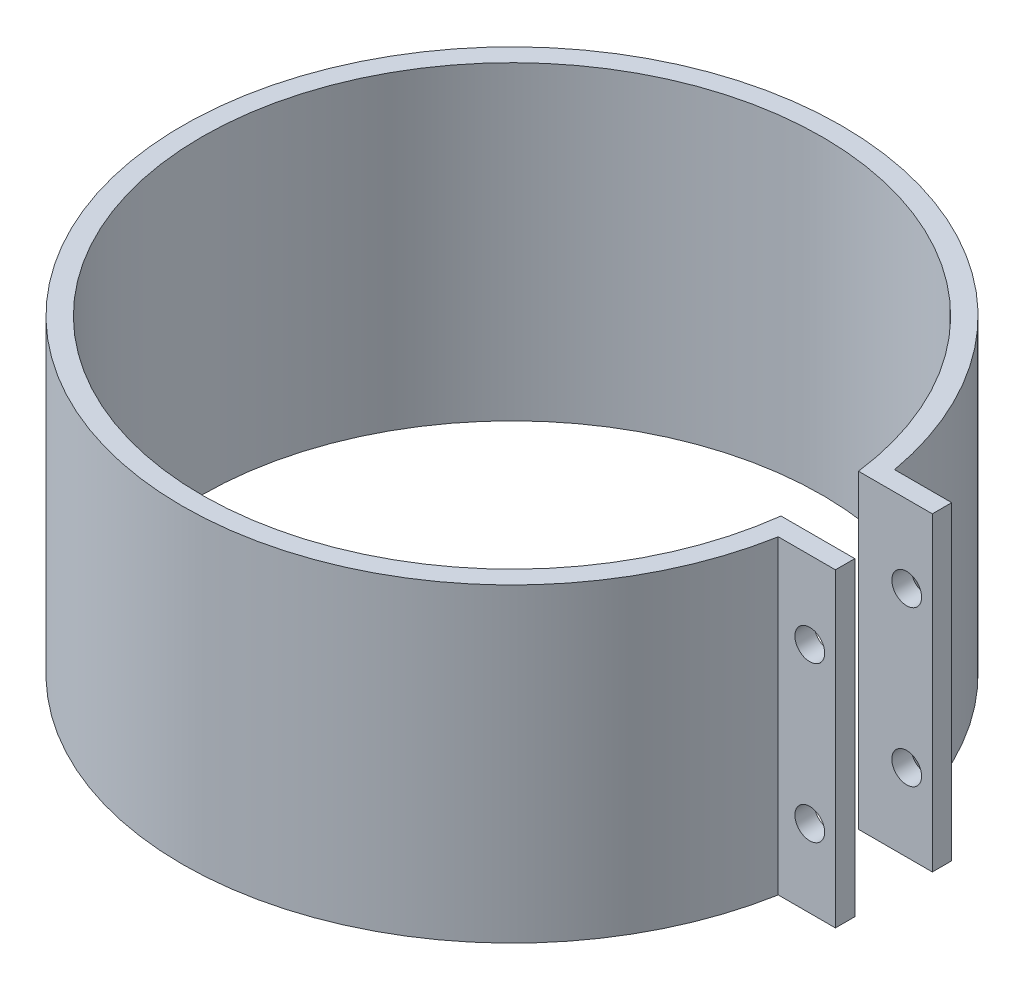
ISO-10303-21;
HEADER;
FILE_DESCRIPTION(('STEP AP214'),'2;1');
FILE_NAME('part.step','',(''),(''),'','','');
FILE_SCHEMA(('AUTOMOTIVE_DESIGN { 1 0 10303 214 1 1 1 1 }'));
ENDSEC;
DATA;
#1=APPLICATION_CONTEXT('core data for automotive mechanical design processes');
#2=APPLICATION_PROTOCOL_DEFINITION('international standard','automotive_design',2000,#1);
#3=PRODUCT_CONTEXT('',#1,'mechanical');
#4=PRODUCT('Part','Part','',(#3));
#5=PRODUCT_RELATED_PRODUCT_CATEGORY('part','',(#4));
#6=PRODUCT_DEFINITION_FORMATION('','',#4);
#7=PRODUCT_DEFINITION_CONTEXT('part definition',#1,'design');
#8=PRODUCT_DEFINITION('design','',#6,#7);
#9=PRODUCT_DEFINITION_SHAPE('','',#8);
#10=(LENGTH_UNIT() NAMED_UNIT(*) SI_UNIT(.MILLI.,.METRE.));
#11=(NAMED_UNIT(*) PLANE_ANGLE_UNIT() SI_UNIT($,.RADIAN.));
#12=(NAMED_UNIT(*) SI_UNIT($,.STERADIAN.) SOLID_ANGLE_UNIT());
#13=UNCERTAINTY_MEASURE_WITH_UNIT(LENGTH_MEASURE(1.E-05),#10,'distance_accuracy_value','');
#14=(GEOMETRIC_REPRESENTATION_CONTEXT(3) GLOBAL_UNCERTAINTY_ASSIGNED_CONTEXT((#13)) GLOBAL_UNIT_ASSIGNED_CONTEXT((#10,
#11,#12)) REPRESENTATION_CONTEXT('',''));
#15=CARTESIAN_POINT('',(0.,0.,0.));
#16=DIRECTION('',(0.,0.,1.));
#17=DIRECTION('',(1.,0.,0.));
#18=AXIS2_PLACEMENT_3D('',#15,#16,#17);
#19=CARTESIAN_POINT('',(0.,50.8,0.));
#20=DIRECTION('',(0.,-1.,0.));
#21=DIRECTION('',(0.,0.,-1.));
#22=AXIS2_PLACEMENT_3D('',#19,#20,#21);
#23=CYLINDRICAL_SURFACE('',#22,53.975);
#24=CARTESIAN_POINT('',(0.,0.,0.));
#25=DIRECTION('',(0.,1.,0.));
#26=DIRECTION('',(0.,0.,1.));
#27=AXIS2_PLACEMENT_3D('',#24,#25,#26);
#28=CIRCLE('',#27,53.975);
#29=CARTESIAN_POINT('',(53.1279116849138,0.,-9.525));
#30=VERTEX_POINT('',#29);
#31=CARTESIAN_POINT('',(53.1279116849138,0.,9.525));
#32=VERTEX_POINT('',#31);
#33=EDGE_CURVE('E135',#30,#32,#28,.T.);
#34=ORIENTED_EDGE('',*,*,#33,.T.);
#35=DIRECTION('',(0.,-1.,0.));
#36=VECTOR('',#35,1.);
#37=CARTESIAN_POINT('',(53.1279116849138,50.8,9.525));
#38=LINE('',#37,#36);
#39=CARTESIAN_POINT('',(53.1279116849138,50.8,9.525));
#40=VERTEX_POINT('',#39);
#41=EDGE_CURVE('E11',#40,#32,#38,.T.);
#42=ORIENTED_EDGE('',*,*,#41,.F.);
#43=CARTESIAN_POINT('',(0.,50.8,0.));
#44=DIRECTION('',(0.,1.,0.));
#45=DIRECTION('',(0.,0.,1.));
#46=AXIS2_PLACEMENT_3D('',#43,#44,#45);
#47=CIRCLE('',#46,53.975);
#48=CARTESIAN_POINT('',(53.1279116849138,50.8,-9.525));
#49=VERTEX_POINT('',#48);
#50=EDGE_CURVE('E155',#49,#40,#47,.T.);
#51=ORIENTED_EDGE('',*,*,#50,.F.);
#52=DIRECTION('',(0.,-1.,0.));
#53=VECTOR('',#52,1.);
#54=CARTESIAN_POINT('',(53.1279116849138,50.8,-9.525));
#55=LINE('',#54,#53);
#56=EDGE_CURVE('E131',#49,#30,#55,.T.);
#57=ORIENTED_EDGE('',*,*,#56,.T.);
#58=EDGE_LOOP('',(#34,#42,#51,#57));
#59=FACE_BOUND('',#58,.T.);
#60=ADVANCED_FACE('F37',(#59),#23,.T.);
#61=CARTESIAN_POINT('',(53.6001690762259,50.8,9.525));
#62=DIRECTION('',(0.,0.,-1.));
#63=DIRECTION('',(-1.,0.,0.));
#64=AXIS2_PLACEMENT_3D('',#61,#62,#63);
#65=PLANE('',#64);
#66=CARTESIAN_POINT('',(58.2922060609041,38.1,9.525));
#67=DIRECTION('',(0.,0.,1.));
#68=DIRECTION('',(1.,0.,0.));
#69=AXIS2_PLACEMENT_3D('',#66,#67,#68);
#70=CIRCLE('',#69,2.4384);
#71=CARTESIAN_POINT('',(60.7306060609041,38.1,9.52499999999998));
#72=VERTEX_POINT('',#71);
#73=EDGE_CURVE('E169',#72,#72,#70,.T.);
#74=ORIENTED_EDGE('',*,*,#73,.F.);
#75=EDGE_LOOP('',(#74));
#76=FACE_BOUND('',#75,.T.);
#77=CARTESIAN_POINT('',(58.2922060609041,12.7,9.525));
#78=DIRECTION('',(0.,0.,1.));
#79=DIRECTION('',(1.,0.,0.));
#80=AXIS2_PLACEMENT_3D('',#77,#78,#79);
#81=CIRCLE('',#80,2.4384);
#82=CARTESIAN_POINT('',(60.7306060609041,12.7,9.52499999999998));
#83=VERTEX_POINT('',#82);
#84=EDGE_CURVE('E176',#83,#83,#81,.T.);
#85=ORIENTED_EDGE('',*,*,#84,.F.);
#86=EDGE_LOOP('',(#85));
#87=FACE_BOUND('',#86,.T.);
#88=DIRECTION('',(1.,0.,0.));
#89=VECTOR('',#88,1.);
#90=CARTESIAN_POINT('',(53.6001690762259,0.,9.525));
#91=LINE('',#90,#89);
#92=CARTESIAN_POINT('',(62.4901690762259,0.,9.525));
#93=VERTEX_POINT('',#92);
#94=EDGE_CURVE('E139',#32,#93,#91,.T.);
#95=ORIENTED_EDGE('',*,*,#94,.T.);
#96=DIRECTION('',(0.,-1.,0.));
#97=VECTOR('',#96,1.);
#98=CARTESIAN_POINT('',(62.4901690762259,50.8,9.525));
#99=LINE('',#98,#97);
#100=CARTESIAN_POINT('',(62.4901690762259,50.8,9.525));
#101=VERTEX_POINT('',#100);
#102=EDGE_CURVE('E46',#101,#93,#99,.T.);
#103=ORIENTED_EDGE('',*,*,#102,.F.);
#104=DIRECTION('',(1.,0.,0.));
#105=VECTOR('',#104,1.);
#106=CARTESIAN_POINT('',(53.6001690762259,50.8,9.525));
#107=LINE('',#106,#105);
#108=EDGE_CURVE('E96',#40,#101,#107,.T.);
#109=ORIENTED_EDGE('',*,*,#108,.F.);
#110=ORIENTED_EDGE('',*,*,#41,.T.);
#111=EDGE_LOOP('',(#95,#103,#109,#110));
#112=FACE_BOUND('',#111,.T.);
#113=ADVANCED_FACE('F210',(#76,#87,#112),#65,.F.);
#114=CARTESIAN_POINT('',(62.4901690762259,50.8,6.35));
#115=DIRECTION('',(-1.,0.,0.));
#116=DIRECTION('',(0.,0.,1.));
#117=AXIS2_PLACEMENT_3D('',#114,#115,#116);
#118=PLANE('',#117);
#119=DIRECTION('',(0.,0.,-1.));
#120=VECTOR('',#119,1.);
#121=CARTESIAN_POINT('',(62.4901690762259,0.,6.35));
#122=LINE('',#121,#120);
#123=CARTESIAN_POINT('',(62.4901690762259,0.,6.35));
#124=VERTEX_POINT('',#123);
#125=EDGE_CURVE('E142',#93,#124,#122,.T.);
#126=ORIENTED_EDGE('',*,*,#125,.T.);
#127=DIRECTION('',(0.,-1.,0.));
#128=VECTOR('',#127,1.);
#129=CARTESIAN_POINT('',(62.4901690762259,50.8,6.35));
#130=LINE('',#129,#128);
#131=CARTESIAN_POINT('',(62.4901690762259,50.8,6.35));
#132=VERTEX_POINT('',#131);
#133=EDGE_CURVE('E162',#132,#124,#130,.T.);
#134=ORIENTED_EDGE('',*,*,#133,.F.);
#135=DIRECTION('',(0.,0.,-1.));
#136=VECTOR('',#135,1.);
#137=CARTESIAN_POINT('',(62.4901690762259,50.8,6.35));
#138=LINE('',#137,#136);
#139=EDGE_CURVE('E192',#101,#132,#138,.T.);
#140=ORIENTED_EDGE('',*,*,#139,.F.);
#141=ORIENTED_EDGE('',*,*,#102,.T.);
#142=EDGE_LOOP('',(#126,#134,#140,#141));
#143=FACE_BOUND('',#142,.T.);
#144=ADVANCED_FACE('F212',(#143),#118,.F.);
#145=CARTESIAN_POINT('',(53.6001690762259,50.8,6.35));
#146=DIRECTION('',(0.,0.,1.));
#147=DIRECTION('',(1.,0.,0.));
#148=AXIS2_PLACEMENT_3D('',#145,#146,#147);
#149=PLANE('',#148);
#150=CARTESIAN_POINT('',(58.2922060609041,38.1,6.35));
#151=DIRECTION('',(0.,0.,1.));
#152=DIRECTION('',(1.,0.,0.));
#153=AXIS2_PLACEMENT_3D('',#150,#151,#152);
#154=CIRCLE('',#153,2.4384);
#155=CARTESIAN_POINT('',(60.7306060609041,38.1,6.34999999999999));
#156=VERTEX_POINT('',#155);
#157=EDGE_CURVE('E140',#156,#156,#154,.T.);
#158=ORIENTED_EDGE('',*,*,#157,.T.);
#159=EDGE_LOOP('',(#158));
#160=FACE_BOUND('',#159,.T.);
#161=CARTESIAN_POINT('',(58.2922060609041,12.7,6.35));
#162=DIRECTION('',(0.,0.,1.));
#163=DIRECTION('',(1.,0.,0.));
#164=AXIS2_PLACEMENT_3D('',#161,#162,#163);
#165=CIRCLE('',#164,2.4384);
#166=CARTESIAN_POINT('',(60.7306060609041,12.7,6.34999999999999));
#167=VERTEX_POINT('',#166);
#168=EDGE_CURVE('E173',#167,#167,#165,.T.);
#169=ORIENTED_EDGE('',*,*,#168,.T.);
#170=EDGE_LOOP('',(#169));
#171=FACE_BOUND('',#170,.T.);
#172=DIRECTION('',(-1.,0.,0.));
#173=VECTOR('',#172,1.);
#174=CARTESIAN_POINT('',(53.6001690762259,0.,6.35));
#175=LINE('',#174,#173);
#176=CARTESIAN_POINT('',(50.4015624757805,0.,6.35000000000001));
#177=VERTEX_POINT('',#176);
#178=EDGE_CURVE('E145',#124,#177,#175,.T.);
#179=ORIENTED_EDGE('',*,*,#178,.T.);
#180=DIRECTION('',(0.,-1.,0.));
#181=VECTOR('',#180,1.);
#182=CARTESIAN_POINT('',(50.4015624757805,50.8,6.35000000000001));
#183=LINE('',#182,#181);
#184=CARTESIAN_POINT('',(50.4015624757805,50.8,6.35000000000001));
#185=VERTEX_POINT('',#184);
#186=EDGE_CURVE('E159',#185,#177,#183,.T.);
#187=ORIENTED_EDGE('',*,*,#186,.F.);
#188=DIRECTION('',(-1.,0.,0.));
#189=VECTOR('',#188,1.);
#190=CARTESIAN_POINT('',(53.6001690762259,50.8,6.35));
#191=LINE('',#190,#189);
#192=EDGE_CURVE('E194',#132,#185,#191,.T.);
#193=ORIENTED_EDGE('',*,*,#192,.F.);
#194=ORIENTED_EDGE('',*,*,#133,.T.);
#195=EDGE_LOOP('',(#179,#187,#193,#194));
#196=FACE_BOUND('',#195,.T.);
#197=ADVANCED_FACE('F200',(#160,#171,#196),#149,.F.);
#198=CARTESIAN_POINT('',(0.,50.8,0.));
#199=DIRECTION('',(0.,-1.,0.));
#200=DIRECTION('',(0.,0.,-1.));
#201=AXIS2_PLACEMENT_3D('',#198,#199,#200);
#202=CYLINDRICAL_SURFACE('',#201,50.8);
#203=CARTESIAN_POINT('',(0.,0.,0.));
#204=DIRECTION('',(0.,-1.,0.));
#205=DIRECTION('',(0.,0.,1.));
#206=AXIS2_PLACEMENT_3D('',#203,#204,#205);
#207=CIRCLE('',#206,50.8);
#208=CARTESIAN_POINT('',(50.4015624757805,0.,-6.35));
#209=VERTEX_POINT('',#208);
#210=EDGE_CURVE('E147',#177,#209,#207,.T.);
#211=ORIENTED_EDGE('',*,*,#210,.T.);
#212=DIRECTION('',(0.,-1.,0.));
#213=VECTOR('',#212,1.);
#214=CARTESIAN_POINT('',(50.4015624757805,50.8,-6.35));
#215=LINE('',#214,#213);
#216=CARTESIAN_POINT('',(50.4015624757805,50.8,-6.35));
#217=VERTEX_POINT('',#216);
#218=EDGE_CURVE('E126',#217,#209,#215,.T.);
#219=ORIENTED_EDGE('',*,*,#218,.F.);
#220=CARTESIAN_POINT('',(0.,50.8,0.));
#221=DIRECTION('',(0.,-1.,0.));
#222=DIRECTION('',(0.,0.,1.));
#223=AXIS2_PLACEMENT_3D('',#220,#221,#222);
#224=CIRCLE('',#223,50.8);
#225=EDGE_CURVE('E116',#185,#217,#224,.T.);
#226=ORIENTED_EDGE('',*,*,#225,.F.);
#227=ORIENTED_EDGE('',*,*,#186,.T.);
#228=EDGE_LOOP('',(#211,#219,#226,#227));
#229=FACE_BOUND('',#228,.T.);
#230=ADVANCED_FACE('F203',(#229),#202,.F.);
#231=CARTESIAN_POINT('',(53.6001690762259,50.8,-6.35));
#232=DIRECTION('',(0.,0.,-1.));
#233=DIRECTION('',(-1.,0.,0.));
#234=AXIS2_PLACEMENT_3D('',#231,#232,#233);
#235=PLANE('',#234);
#236=CARTESIAN_POINT('',(58.2922060609041,38.1,-6.35));
#237=DIRECTION('',(0.,0.,-1.));
#238=DIRECTION('',(-1.,0.,0.));
#239=AXIS2_PLACEMENT_3D('',#236,#237,#238);
#240=CIRCLE('',#239,2.4384);
#241=CARTESIAN_POINT('',(60.7306060609041,38.1,-6.34999999999999));
#242=VERTEX_POINT('',#241);
#243=EDGE_CURVE('E185',#242,#242,#240,.T.);
#244=ORIENTED_EDGE('',*,*,#243,.T.);
#245=EDGE_LOOP('',(#244));
#246=FACE_BOUND('',#245,.T.);
#247=CARTESIAN_POINT('',(58.2922060609041,12.7,-6.35));
#248=DIRECTION('',(0.,0.,-1.));
#249=DIRECTION('',(-1.,0.,0.));
#250=AXIS2_PLACEMENT_3D('',#247,#248,#249);
#251=CIRCLE('',#250,2.4384);
#252=CARTESIAN_POINT('',(60.7306060609041,12.7,-6.34999999999999));
#253=VERTEX_POINT('',#252);
#254=EDGE_CURVE('E168',#253,#253,#251,.T.);
#255=ORIENTED_EDGE('',*,*,#254,.T.);
#256=EDGE_LOOP('',(#255));
#257=FACE_BOUND('',#256,.T.);
#258=DIRECTION('',(1.,0.,0.));
#259=VECTOR('',#258,1.);
#260=CARTESIAN_POINT('',(53.6001690762259,0.,-6.35));
#261=LINE('',#260,#259);
#262=CARTESIAN_POINT('',(62.4901690762259,0.,-6.35));
#263=VERTEX_POINT('',#262);
#264=EDGE_CURVE('E124',#209,#263,#261,.T.);
#265=ORIENTED_EDGE('',*,*,#264,.T.);
#266=DIRECTION('',(0.,-1.,0.));
#267=VECTOR('',#266,1.);
#268=CARTESIAN_POINT('',(62.4901690762259,50.8,-6.35));
#269=LINE('',#268,#267);
#270=CARTESIAN_POINT('',(62.4901690762259,50.8,-6.35));
#271=VERTEX_POINT('',#270);
#272=EDGE_CURVE('E122',#271,#263,#269,.T.);
#273=ORIENTED_EDGE('',*,*,#272,.F.);
#274=DIRECTION('',(1.,0.,0.));
#275=VECTOR('',#274,1.);
#276=CARTESIAN_POINT('',(53.6001690762259,50.8,-6.35));
#277=LINE('',#276,#275);
#278=EDGE_CURVE('E109',#217,#271,#277,.T.);
#279=ORIENTED_EDGE('',*,*,#278,.F.);
#280=ORIENTED_EDGE('',*,*,#218,.T.);
#281=EDGE_LOOP('',(#265,#273,#279,#280));
#282=FACE_BOUND('',#281,.T.);
#283=ADVANCED_FACE('F123',(#246,#257,#282),#235,.F.);
#284=CARTESIAN_POINT('',(62.4901690762259,50.8,-9.525));
#285=DIRECTION('',(-1.,0.,0.));
#286=DIRECTION('',(0.,0.,1.));
#287=AXIS2_PLACEMENT_3D('',#284,#285,#286);
#288=PLANE('',#287);
#289=DIRECTION('',(0.,0.,-1.));
#290=VECTOR('',#289,1.);
#291=CARTESIAN_POINT('',(62.4901690762259,0.,-9.525));
#292=LINE('',#291,#290);
#293=CARTESIAN_POINT('',(62.4901690762259,0.,-9.525));
#294=VERTEX_POINT('',#293);
#295=EDGE_CURVE('E152',#263,#294,#292,.T.);
#296=ORIENTED_EDGE('',*,*,#295,.T.);
#297=DIRECTION('',(0.,-1.,0.));
#298=VECTOR('',#297,1.);
#299=CARTESIAN_POINT('',(62.4901690762259,50.8,-9.525));
#300=LINE('',#299,#298);
#301=CARTESIAN_POINT('',(62.4901690762259,50.8,-9.525));
#302=VERTEX_POINT('',#301);
#303=EDGE_CURVE('E127',#302,#294,#300,.T.);
#304=ORIENTED_EDGE('',*,*,#303,.F.);
#305=DIRECTION('',(0.,0.,-1.));
#306=VECTOR('',#305,1.);
#307=CARTESIAN_POINT('',(62.4901690762259,50.8,-9.525));
#308=LINE('',#307,#306);
#309=EDGE_CURVE('E113',#271,#302,#308,.T.);
#310=ORIENTED_EDGE('',*,*,#309,.F.);
#311=ORIENTED_EDGE('',*,*,#272,.T.);
#312=EDGE_LOOP('',(#296,#304,#310,#311));
#313=FACE_BOUND('',#312,.T.);
#314=ADVANCED_FACE('F129',(#313),#288,.F.);
#315=CARTESIAN_POINT('',(53.6001690762259,50.8,-9.525));
#316=DIRECTION('',(0.,0.,1.));
#317=DIRECTION('',(1.,0.,0.));
#318=AXIS2_PLACEMENT_3D('',#315,#316,#317);
#319=PLANE('',#318);
#320=CARTESIAN_POINT('',(58.2922060609041,38.1,-9.52500000000003));
#321=DIRECTION('',(0.,0.,1.));
#322=DIRECTION('',(1.,0.,0.));
#323=AXIS2_PLACEMENT_3D('',#320,#321,#322);
#324=CIRCLE('',#323,2.4384);
#325=CARTESIAN_POINT('',(60.7306060609041,38.1,-9.52500000000005));
#326=VERTEX_POINT('',#325);
#327=EDGE_CURVE('E40',#326,#326,#324,.T.);
#328=ORIENTED_EDGE('',*,*,#327,.T.);
#329=EDGE_LOOP('',(#328));
#330=FACE_BOUND('',#329,.T.);
#331=CARTESIAN_POINT('',(58.2922060609041,12.7,-9.52500000000003));
#332=DIRECTION('',(0.,0.,1.));
#333=DIRECTION('',(1.,0.,0.));
#334=AXIS2_PLACEMENT_3D('',#331,#332,#333);
#335=CIRCLE('',#334,2.4384);
#336=CARTESIAN_POINT('',(60.7306060609041,12.7,-9.52500000000005));
#337=VERTEX_POINT('',#336);
#338=EDGE_CURVE('E166',#337,#337,#335,.T.);
#339=ORIENTED_EDGE('',*,*,#338,.T.);
#340=EDGE_LOOP('',(#339));
#341=FACE_BOUND('',#340,.T.);
#342=DIRECTION('',(-1.,0.,0.));
#343=VECTOR('',#342,1.);
#344=CARTESIAN_POINT('',(53.6001690762259,0.,-9.525));
#345=LINE('',#344,#343);
#346=EDGE_CURVE('E84',#294,#30,#345,.T.);
#347=ORIENTED_EDGE('',*,*,#346,.T.);
#348=ORIENTED_EDGE('',*,*,#56,.F.);
#349=DIRECTION('',(-1.,0.,0.));
#350=VECTOR('',#349,1.);
#351=CARTESIAN_POINT('',(53.6001690762259,50.8,-9.525));
#352=LINE('',#351,#350);
#353=EDGE_CURVE('E55',#302,#49,#352,.T.);
#354=ORIENTED_EDGE('',*,*,#353,.F.);
#355=ORIENTED_EDGE('',*,*,#303,.T.);
#356=EDGE_LOOP('',(#347,#348,#354,#355));
#357=FACE_BOUND('',#356,.T.);
#358=ADVANCED_FACE('F206',(#330,#341,#357),#319,.F.);
#359=CARTESIAN_POINT('',(0.,50.8,0.));
#360=DIRECTION('',(0.,1.,0.));
#361=DIRECTION('',(0.,0.,1.));
#362=AXIS2_PLACEMENT_3D('',#359,#360,#361);
#363=PLANE('',#362);
#364=ORIENTED_EDGE('',*,*,#50,.T.);
#365=ORIENTED_EDGE('',*,*,#108,.T.);
#366=ORIENTED_EDGE('',*,*,#139,.T.);
#367=ORIENTED_EDGE('',*,*,#192,.T.);
#368=ORIENTED_EDGE('',*,*,#225,.T.);
#369=ORIENTED_EDGE('',*,*,#278,.T.);
#370=ORIENTED_EDGE('',*,*,#309,.T.);
#371=ORIENTED_EDGE('',*,*,#353,.T.);
#372=EDGE_LOOP('',(#364,#365,#366,#367,#368,#369,#370,#371));
#373=FACE_BOUND('',#372,.T.);
#374=ADVANCED_FACE('F111',(#373),#363,.T.);
#375=CARTESIAN_POINT('',(0.,0.,0.));
#376=DIRECTION('',(0.,1.,0.));
#377=DIRECTION('',(0.,0.,1.));
#378=AXIS2_PLACEMENT_3D('',#375,#376,#377);
#379=PLANE('',#378);
#380=ORIENTED_EDGE('',*,*,#33,.F.);
#381=ORIENTED_EDGE('',*,*,#346,.F.);
#382=ORIENTED_EDGE('',*,*,#295,.F.);
#383=ORIENTED_EDGE('',*,*,#264,.F.);
#384=ORIENTED_EDGE('',*,*,#210,.F.);
#385=ORIENTED_EDGE('',*,*,#178,.F.);
#386=ORIENTED_EDGE('',*,*,#125,.F.);
#387=ORIENTED_EDGE('',*,*,#94,.F.);
#388=EDGE_LOOP('',(#380,#381,#382,#383,#384,#385,#386,#387));
#389=FACE_BOUND('',#388,.T.);
#390=ADVANCED_FACE('F204',(#389),#379,.F.);
#391=CARTESIAN_POINT('',(58.2922060609041,12.7,-53.975));
#392=DIRECTION('',(0.,0.,1.));
#393=DIRECTION('',(1.,0.,0.));
#394=AXIS2_PLACEMENT_3D('',#391,#392,#393);
#395=CYLINDRICAL_SURFACE('',#394,2.4384);
#396=CARTESIAN_POINT('',(60.7306060609041,12.7,-9.52500000000005));
#397=CARTESIAN_POINT('',(60.7306060609041,12.7,-9.49192708333338));
#398=CARTESIAN_POINT('',(60.7306060609041,12.7,-9.45885416666671));
#399=CARTESIAN_POINT('',(60.7306060609041,12.7,-9.39270833333338));
#400=CARTESIAN_POINT('',(60.7306060609041,12.7,-9.35963541666671));
#401=CARTESIAN_POINT('',(60.7306060609041,12.7,-9.29348958333338));
#402=CARTESIAN_POINT('',(60.7306060609041,12.7,-9.26041666666671));
#403=CARTESIAN_POINT('',(60.7306060609041,12.7,-9.19427083333337));
#404=CARTESIAN_POINT('',(60.7306060609041,12.7,-9.16119791666671));
#405=CARTESIAN_POINT('',(60.7306060609041,12.7,-9.09505208333337));
#406=CARTESIAN_POINT('',(60.7306060609041,12.7,-9.06197916666671));
#407=CARTESIAN_POINT('',(60.7306060609041,12.7,-8.99583333333337));
#408=CARTESIAN_POINT('',(60.7306060609041,12.7,-8.96276041666671));
#409=CARTESIAN_POINT('',(60.7306060609041,12.7,-8.89661458333337));
#410=CARTESIAN_POINT('',(60.7306060609041,12.7,-8.8635416666667));
#411=CARTESIAN_POINT('',(60.7306060609041,12.7,-8.79739583333337));
#412=CARTESIAN_POINT('',(60.7306060609041,12.7,-8.7643229166667));
#413=CARTESIAN_POINT('',(60.7306060609041,12.7,-8.69817708333337));
#414=CARTESIAN_POINT('',(60.7306060609041,12.7,-8.6651041666667));
#415=CARTESIAN_POINT('',(60.7306060609041,12.7,-8.59895833333336));
#416=CARTESIAN_POINT('',(60.7306060609041,12.7,-8.5658854166667));
#417=CARTESIAN_POINT('',(60.7306060609041,12.7,-8.49973958333336));
#418=CARTESIAN_POINT('',(60.7306060609041,12.7,-8.4666666666667));
#419=CARTESIAN_POINT('',(60.7306060609041,12.7,-8.40052083333336));
#420=CARTESIAN_POINT('',(60.7306060609041,12.7,-8.36744791666669));
#421=CARTESIAN_POINT('',(60.7306060609041,12.7,-8.30130208333336));
#422=CARTESIAN_POINT('',(60.7306060609041,12.7,-8.26822916666669));
#423=CARTESIAN_POINT('',(60.7306060609041,12.7,-8.20208333333336));
#424=CARTESIAN_POINT('',(60.7306060609041,12.7,-8.16901041666669));
#425=CARTESIAN_POINT('',(60.7306060609041,12.7,-8.10286458333336));
#426=CARTESIAN_POINT('',(60.7306060609041,12.7,-8.06979166666669));
#427=CARTESIAN_POINT('',(60.7306060609041,12.7,-8.00364583333336));
#428=CARTESIAN_POINT('',(60.7306060609041,12.7,-7.97057291666669));
#429=CARTESIAN_POINT('',(60.7306060609041,12.7,-7.90442708333335));
#430=CARTESIAN_POINT('',(60.7306060609041,12.7,-7.87135416666668));
#431=CARTESIAN_POINT('',(60.7306060609041,12.7,-7.80520833333335));
#432=CARTESIAN_POINT('',(60.7306060609041,12.7,-7.77213541666668));
#433=CARTESIAN_POINT('',(60.7306060609041,12.7,-7.70598958333335));
#434=CARTESIAN_POINT('',(60.7306060609041,12.7,-7.67291666666668));
#435=CARTESIAN_POINT('',(60.7306060609041,12.7,-7.60677083333335));
#436=CARTESIAN_POINT('',(60.7306060609041,12.7,-7.57369791666668));
#437=CARTESIAN_POINT('',(60.7306060609041,12.7,-7.50755208333335));
#438=CARTESIAN_POINT('',(60.7306060609041,12.7,-7.47447916666668));
#439=CARTESIAN_POINT('',(60.7306060609041,12.7,-7.40833333333335));
#440=CARTESIAN_POINT('',(60.7306060609041,12.7,-7.37526041666668));
#441=CARTESIAN_POINT('',(60.7306060609041,12.7,-7.30911458333335));
#442=CARTESIAN_POINT('',(60.7306060609041,12.7,-7.27604166666668));
#443=CARTESIAN_POINT('',(60.7306060609041,12.7,-7.20989583333334));
#444=CARTESIAN_POINT('',(60.7306060609041,12.7,-7.17682291666667));
#445=CARTESIAN_POINT('',(60.7306060609041,12.7,-7.11067708333334));
#446=CARTESIAN_POINT('',(60.7306060609041,12.7,-7.07760416666667));
#447=CARTESIAN_POINT('',(60.7306060609041,12.7,-7.01145833333334));
#448=CARTESIAN_POINT('',(60.7306060609041,12.7,-6.97838541666667));
#449=CARTESIAN_POINT('',(60.7306060609041,12.7,-6.91223958333334));
#450=CARTESIAN_POINT('',(60.7306060609041,12.7,-6.87916666666667));
#451=CARTESIAN_POINT('',(60.7306060609041,12.7,-6.81302083333334));
#452=CARTESIAN_POINT('',(60.7306060609041,12.7,-6.77994791666667));
#453=CARTESIAN_POINT('',(60.7306060609041,12.7,-6.71380208333333));
#454=CARTESIAN_POINT('',(60.7306060609041,12.7,-6.68072916666667));
#455=CARTESIAN_POINT('',(60.7306060609041,12.7,-6.61458333333333));
#456=CARTESIAN_POINT('',(60.7306060609041,12.7,-6.58151041666667));
#457=CARTESIAN_POINT('',(60.7306060609041,12.7,-6.51536458333333));
#458=CARTESIAN_POINT('',(60.7306060609041,12.7,-6.48229166666667));
#459=CARTESIAN_POINT('',(60.7306060609041,12.7,-6.41614583333333));
#460=CARTESIAN_POINT('',(60.7306060609041,12.7,-6.38307291666666));
#461=CARTESIAN_POINT('',(60.7306060609041,12.7,-6.34999999999999));
#462=B_SPLINE_CURVE_WITH_KNOTS('',3,(#396,#397,#398,#399,#400,#401,#402,#403,#404,#405,#406,
#407,#408,#409,#410,#411,#412,#413,#414,#415,#416,#417,#418,#419,#420,#421,#422,#423,#424,#425,
#426,#427,#428,#429,#430,#431,#432,#433,#434,#435,#436,#437,#438,#439,#440,#441,#442,#443,#444,
#445,#446,#447,#448,#449,#450,#451,#452,#453,#454,#455,#456,#457,#458,#459,#460,#461),
.UNSPECIFIED.,.F.,.F.,(4,2,2,2,2,2,2,2,2,2,2,2,2,2,2,2,2,2,2,2,2,2,2,2,2,2,2,2,2,2,2,2,4),(0.,
0.0992187500000047,0.198437500000002,0.297656250000007,0.396875000000005,0.49609375000001,
0.595312500000007,0.694531250000012,0.79375000000001,0.892968750000014,0.992187500000019,
1.09140625000002,1.19062500000002,1.28984375000002,1.38906250000002,1.48828125000002,
1.58750000000003,1.68671875000003,1.78593750000003,1.88515625000003,1.98437500000003,
2.08359375000004,2.18281250000003,2.28203125000004,2.38125000000004,2.48046875000004,
2.57968750000005,2.67890625000004,2.77812500000005,2.87734375000005,2.97656250000005,
3.07578125000005,3.17500000000005),.UNSPECIFIED.);
#463=EDGE_CURVE('BSEAM274',#337,#253,#462,.T.);
#464=ORIENTED_EDGE('',*,*,#338,.F.);
#465=ORIENTED_EDGE('',*,*,#254,.F.);
#466=ORIENTED_EDGE('',*,*,#463,.T.);
#467=ORIENTED_EDGE('',*,*,#463,.F.);
#468=EDGE_LOOP('',(#464,#466,#465,#467));
#469=FACE_BOUND('',#468,.T.);
#470=ADVANCED_FACE('F274',(#469),#395,.F.);
#471=CARTESIAN_POINT('',(58.2922060609041,38.1,-53.975));
#472=DIRECTION('',(0.,0.,1.));
#473=DIRECTION('',(1.,0.,0.));
#474=AXIS2_PLACEMENT_3D('',#471,#472,#473);
#475=CYLINDRICAL_SURFACE('',#474,2.4384);
#476=CARTESIAN_POINT('',(60.7306060609041,38.1,-9.52500000000005));
#477=CARTESIAN_POINT('',(60.7306060609041,38.1,-9.49192708333338));
#478=CARTESIAN_POINT('',(60.7306060609041,38.1,-9.45885416666671));
#479=CARTESIAN_POINT('',(60.7306060609041,38.1,-9.39270833333338));
#480=CARTESIAN_POINT('',(60.7306060609041,38.1,-9.35963541666671));
#481=CARTESIAN_POINT('',(60.7306060609041,38.1,-9.29348958333338));
#482=CARTESIAN_POINT('',(60.7306060609041,38.1,-9.26041666666671));
#483=CARTESIAN_POINT('',(60.7306060609041,38.1,-9.19427083333337));
#484=CARTESIAN_POINT('',(60.7306060609041,38.1,-9.16119791666671));
#485=CARTESIAN_POINT('',(60.7306060609041,38.1,-9.09505208333337));
#486=CARTESIAN_POINT('',(60.7306060609041,38.1,-9.06197916666671));
#487=CARTESIAN_POINT('',(60.7306060609041,38.1,-8.99583333333337));
#488=CARTESIAN_POINT('',(60.7306060609041,38.1,-8.96276041666671));
#489=CARTESIAN_POINT('',(60.7306060609041,38.1,-8.89661458333337));
#490=CARTESIAN_POINT('',(60.7306060609041,38.1,-8.8635416666667));
#491=CARTESIAN_POINT('',(60.7306060609041,38.1,-8.79739583333337));
#492=CARTESIAN_POINT('',(60.7306060609041,38.1,-8.7643229166667));
#493=CARTESIAN_POINT('',(60.7306060609041,38.1,-8.69817708333337));
#494=CARTESIAN_POINT('',(60.7306060609041,38.1,-8.6651041666667));
#495=CARTESIAN_POINT('',(60.7306060609041,38.1,-8.59895833333336));
#496=CARTESIAN_POINT('',(60.7306060609041,38.1,-8.5658854166667));
#497=CARTESIAN_POINT('',(60.7306060609041,38.1,-8.49973958333336));
#498=CARTESIAN_POINT('',(60.7306060609041,38.1,-8.4666666666667));
#499=CARTESIAN_POINT('',(60.7306060609041,38.1,-8.40052083333336));
#500=CARTESIAN_POINT('',(60.7306060609041,38.1,-8.36744791666669));
#501=CARTESIAN_POINT('',(60.7306060609041,38.1,-8.30130208333336));
#502=CARTESIAN_POINT('',(60.7306060609041,38.1,-8.26822916666669));
#503=CARTESIAN_POINT('',(60.7306060609041,38.1,-8.20208333333336));
#504=CARTESIAN_POINT('',(60.7306060609041,38.1,-8.16901041666669));
#505=CARTESIAN_POINT('',(60.7306060609041,38.1,-8.10286458333336));
#506=CARTESIAN_POINT('',(60.7306060609041,38.1,-8.06979166666669));
#507=CARTESIAN_POINT('',(60.7306060609041,38.1,-8.00364583333336));
#508=CARTESIAN_POINT('',(60.7306060609041,38.1,-7.97057291666669));
#509=CARTESIAN_POINT('',(60.7306060609041,38.1,-7.90442708333335));
#510=CARTESIAN_POINT('',(60.7306060609041,38.1,-7.87135416666668));
#511=CARTESIAN_POINT('',(60.7306060609041,38.1,-7.80520833333335));
#512=CARTESIAN_POINT('',(60.7306060609041,38.1,-7.77213541666668));
#513=CARTESIAN_POINT('',(60.7306060609041,38.1,-7.70598958333335));
#514=CARTESIAN_POINT('',(60.7306060609041,38.1,-7.67291666666668));
#515=CARTESIAN_POINT('',(60.7306060609041,38.1,-7.60677083333335));
#516=CARTESIAN_POINT('',(60.7306060609041,38.1,-7.57369791666668));
#517=CARTESIAN_POINT('',(60.7306060609041,38.1,-7.50755208333335));
#518=CARTESIAN_POINT('',(60.7306060609041,38.1,-7.47447916666668));
#519=CARTESIAN_POINT('',(60.7306060609041,38.1,-7.40833333333335));
#520=CARTESIAN_POINT('',(60.7306060609041,38.1,-7.37526041666668));
#521=CARTESIAN_POINT('',(60.7306060609041,38.1,-7.30911458333335));
#522=CARTESIAN_POINT('',(60.7306060609041,38.1,-7.27604166666668));
#523=CARTESIAN_POINT('',(60.7306060609041,38.1,-7.20989583333334));
#524=CARTESIAN_POINT('',(60.7306060609041,38.1,-7.17682291666667));
#525=CARTESIAN_POINT('',(60.7306060609041,38.1,-7.11067708333334));
#526=CARTESIAN_POINT('',(60.7306060609041,38.1,-7.07760416666667));
#527=CARTESIAN_POINT('',(60.7306060609041,38.1,-7.01145833333334));
#528=CARTESIAN_POINT('',(60.7306060609041,38.1,-6.97838541666667));
#529=CARTESIAN_POINT('',(60.7306060609041,38.1,-6.91223958333334));
#530=CARTESIAN_POINT('',(60.7306060609041,38.1,-6.87916666666667));
#531=CARTESIAN_POINT('',(60.7306060609041,38.1,-6.81302083333334));
#532=CARTESIAN_POINT('',(60.7306060609041,38.1,-6.77994791666667));
#533=CARTESIAN_POINT('',(60.7306060609041,38.1,-6.71380208333333));
#534=CARTESIAN_POINT('',(60.7306060609041,38.1,-6.68072916666667));
#535=CARTESIAN_POINT('',(60.7306060609041,38.1,-6.61458333333333));
#536=CARTESIAN_POINT('',(60.7306060609041,38.1,-6.58151041666667));
#537=CARTESIAN_POINT('',(60.7306060609041,38.1,-6.51536458333333));
#538=CARTESIAN_POINT('',(60.7306060609041,38.1,-6.48229166666667));
#539=CARTESIAN_POINT('',(60.7306060609041,38.1,-6.41614583333333));
#540=CARTESIAN_POINT('',(60.7306060609041,38.1,-6.38307291666666));
#541=CARTESIAN_POINT('',(60.7306060609041,38.1,-6.34999999999999));
#542=B_SPLINE_CURVE_WITH_KNOTS('',3,(#476,#477,#478,#479,#480,#481,#482,#483,#484,#485,#486,
#487,#488,#489,#490,#491,#492,#493,#494,#495,#496,#497,#498,#499,#500,#501,#502,#503,#504,#505,
#506,#507,#508,#509,#510,#511,#512,#513,#514,#515,#516,#517,#518,#519,#520,#521,#522,#523,#524,
#525,#526,#527,#528,#529,#530,#531,#532,#533,#534,#535,#536,#537,#538,#539,#540,#541),
.UNSPECIFIED.,.F.,.F.,(4,2,2,2,2,2,2,2,2,2,2,2,2,2,2,2,2,2,2,2,2,2,2,2,2,2,2,2,2,2,2,2,4),(0.,
0.0992187500000047,0.198437500000002,0.297656250000007,0.396875000000005,0.49609375000001,
0.595312500000007,0.694531250000012,0.79375000000001,0.892968750000014,0.992187500000019,
1.09140625000002,1.19062500000002,1.28984375000002,1.38906250000002,1.48828125000002,
1.58750000000003,1.68671875000003,1.78593750000003,1.88515625000003,1.98437500000003,
2.08359375000004,2.18281250000003,2.28203125000004,2.38125000000004,2.48046875000004,
2.57968750000005,2.67890625000004,2.77812500000005,2.87734375000005,2.97656250000005,
3.07578125000005,3.17500000000005),.UNSPECIFIED.);
#543=EDGE_CURVE('BSEAM279',#326,#242,#542,.T.);
#544=ORIENTED_EDGE('',*,*,#327,.F.);
#545=ORIENTED_EDGE('',*,*,#243,.F.);
#546=ORIENTED_EDGE('',*,*,#543,.T.);
#547=ORIENTED_EDGE('',*,*,#543,.F.);
#548=EDGE_LOOP('',(#544,#546,#545,#547));
#549=FACE_BOUND('',#548,.T.);
#550=ADVANCED_FACE('F279',(#549),#475,.F.);
#551=CARTESIAN_POINT('',(60.7306060609041,12.7,9.52499999999998));
#552=CARTESIAN_POINT('',(60.7306060609041,12.7,9.49192708333332));
#553=CARTESIAN_POINT('',(60.7306060609041,12.7,9.45885416666665));
#554=CARTESIAN_POINT('',(60.7306060609041,12.7,9.39270833333332));
#555=CARTESIAN_POINT('',(60.7306060609041,12.7,9.35963541666665));
#556=CARTESIAN_POINT('',(60.7306060609041,12.7,9.29348958333332));
#557=CARTESIAN_POINT('',(60.7306060609041,12.7,9.26041666666665));
#558=CARTESIAN_POINT('',(60.7306060609041,12.7,9.19427083333332));
#559=CARTESIAN_POINT('',(60.7306060609041,12.7,9.16119791666665));
#560=CARTESIAN_POINT('',(60.7306060609041,12.7,9.09505208333332));
#561=CARTESIAN_POINT('',(60.7306060609041,12.7,9.06197916666665));
#562=CARTESIAN_POINT('',(60.7306060609041,12.7,8.99583333333332));
#563=CARTESIAN_POINT('',(60.7306060609041,12.7,8.96276041666665));
#564=CARTESIAN_POINT('',(60.7306060609041,12.7,8.89661458333332));
#565=CARTESIAN_POINT('',(60.7306060609041,12.7,8.86354166666665));
#566=CARTESIAN_POINT('',(60.7306060609041,12.7,8.79739583333332));
#567=CARTESIAN_POINT('',(60.7306060609041,12.7,8.76432291666665));
#568=CARTESIAN_POINT('',(60.7306060609041,12.7,8.69817708333332));
#569=CARTESIAN_POINT('',(60.7306060609041,12.7,8.66510416666665));
#570=CARTESIAN_POINT('',(60.7306060609041,12.7,8.59895833333332));
#571=CARTESIAN_POINT('',(60.7306060609041,12.7,8.56588541666665));
#572=CARTESIAN_POINT('',(60.7306060609041,12.7,8.49973958333332));
#573=CARTESIAN_POINT('',(60.7306060609041,12.7,8.46666666666666));
#574=CARTESIAN_POINT('',(60.7306060609041,12.7,8.40052083333333));
#575=CARTESIAN_POINT('',(60.7306060609041,12.7,8.36744791666666));
#576=CARTESIAN_POINT('',(60.7306060609041,12.7,8.30130208333332));
#577=CARTESIAN_POINT('',(60.7306060609041,12.7,8.26822916666666));
#578=CARTESIAN_POINT('',(60.7306060609041,12.7,8.20208333333333));
#579=CARTESIAN_POINT('',(60.7306060609041,12.7,8.16901041666666));
#580=CARTESIAN_POINT('',(60.7306060609041,12.7,8.10286458333333));
#581=CARTESIAN_POINT('',(60.7306060609041,12.7,8.06979166666666));
#582=CARTESIAN_POINT('',(60.7306060609041,12.7,8.00364583333332));
#583=CARTESIAN_POINT('',(60.7306060609041,12.7,7.97057291666666));
#584=CARTESIAN_POINT('',(60.7306060609041,12.7,7.90442708333333));
#585=CARTESIAN_POINT('',(60.7306060609041,12.7,7.87135416666666));
#586=CARTESIAN_POINT('',(60.7306060609041,12.7,7.80520833333333));
#587=CARTESIAN_POINT('',(60.7306060609041,12.7,7.77213541666666));
#588=CARTESIAN_POINT('',(60.7306060609041,12.7,7.70598958333333));
#589=CARTESIAN_POINT('',(60.7306060609041,12.7,7.67291666666666));
#590=CARTESIAN_POINT('',(60.7306060609041,12.7,7.60677083333333));
#591=CARTESIAN_POINT('',(60.7306060609041,12.7,7.57369791666666));
#592=CARTESIAN_POINT('',(60.7306060609041,12.7,7.50755208333333));
#593=CARTESIAN_POINT('',(60.7306060609041,12.7,7.47447916666666));
#594=CARTESIAN_POINT('',(60.7306060609041,12.7,7.40833333333333));
#595=CARTESIAN_POINT('',(60.7306060609041,12.7,7.37526041666666));
#596=CARTESIAN_POINT('',(60.7306060609041,12.7,7.30911458333333));
#597=CARTESIAN_POINT('',(60.7306060609041,12.7,7.27604166666666));
#598=CARTESIAN_POINT('',(60.7306060609041,12.7,7.20989583333333));
#599=CARTESIAN_POINT('',(60.7306060609041,12.7,7.17682291666666));
#600=CARTESIAN_POINT('',(60.7306060609041,12.7,7.11067708333333));
#601=CARTESIAN_POINT('',(60.7306060609041,12.7,7.07760416666666));
#602=CARTESIAN_POINT('',(60.7306060609041,12.7,7.01145833333333));
#603=CARTESIAN_POINT('',(60.7306060609041,12.7,6.97838541666666));
#604=CARTESIAN_POINT('',(60.7306060609041,12.7,6.91223958333333));
#605=CARTESIAN_POINT('',(60.7306060609041,12.7,6.87916666666666));
#606=CARTESIAN_POINT('',(60.7306060609041,12.7,6.81302083333333));
#607=CARTESIAN_POINT('',(60.7306060609041,12.7,6.77994791666666));
#608=CARTESIAN_POINT('',(60.7306060609041,12.7,6.71380208333333));
#609=CARTESIAN_POINT('',(60.7306060609041,12.7,6.68072916666666));
#610=CARTESIAN_POINT('',(60.7306060609041,12.7,6.61458333333333));
#611=CARTESIAN_POINT('',(60.7306060609041,12.7,6.58151041666666));
#612=CARTESIAN_POINT('',(60.7306060609041,12.7,6.51536458333333));
#613=CARTESIAN_POINT('',(60.7306060609041,12.7,6.48229166666666));
#614=CARTESIAN_POINT('',(60.7306060609041,12.7,6.41614583333333));
#615=CARTESIAN_POINT('',(60.7306060609041,12.7,6.38307291666666));
#616=CARTESIAN_POINT('',(60.7306060609041,12.7,6.34999999999999));
#617=B_SPLINE_CURVE_WITH_KNOTS('',3,(#551,#552,#553,#554,#555,#556,#557,#558,#559,#560,#561,
#562,#563,#564,#565,#566,#567,#568,#569,#570,#571,#572,#573,#574,#575,#576,#577,#578,#579,#580,
#581,#582,#583,#584,#585,#586,#587,#588,#589,#590,#591,#592,#593,#594,#595,#596,#597,#598,#599,
#600,#601,#602,#603,#604,#605,#606,#607,#608,#609,#610,#611,#612,#613,#614,#615,#616),
.UNSPECIFIED.,.F.,.F.,(4,2,2,2,2,2,2,2,2,2,2,2,2,2,2,2,2,2,2,2,2,2,2,2,2,2,2,2,2,2,2,2,4),(0.,
0.0992187500000047,0.198437499999995,0.29765625,0.396875000000005,0.496093749999996,0.5953125,
0.694531250000005,0.793749999999996,0.892968750000001,0.992187500000005,1.09140624999999,
1.19062499999999,1.28984374999999,1.38906249999999,1.48828124999999,1.58749999999999,
1.68671874999999,1.78593749999999,1.88515624999999,1.98437499999999,2.08359374999999,
2.18281249999999,2.28203124999999,2.38124999999999,2.48046874999999,2.57968749999999,
2.67890624999999,2.77812499999999,2.87734374999999,2.97656249999999,3.07578124999999,
3.17499999999999),.UNSPECIFIED.);
#618=EDGE_CURVE('BSEAM282',#83,#167,#617,.T.);
#619=ORIENTED_EDGE('',*,*,#84,.T.);
#620=ORIENTED_EDGE('',*,*,#168,.F.);
#621=ORIENTED_EDGE('',*,*,#618,.T.);
#622=ORIENTED_EDGE('',*,*,#618,.F.);
#623=EDGE_LOOP('',(#619,#621,#620,#622));
#624=FACE_BOUND('',#623,.T.);
#625=ADVANCED_FACE('F282',(#624),#395,.F.);
#626=CARTESIAN_POINT('',(60.7306060609041,38.1,9.52499999999998));
#627=CARTESIAN_POINT('',(60.7306060609041,38.1,9.49192708333332));
#628=CARTESIAN_POINT('',(60.7306060609041,38.1,9.45885416666665));
#629=CARTESIAN_POINT('',(60.7306060609041,38.1,9.39270833333332));
#630=CARTESIAN_POINT('',(60.7306060609041,38.1,9.35963541666665));
#631=CARTESIAN_POINT('',(60.7306060609041,38.1,9.29348958333332));
#632=CARTESIAN_POINT('',(60.7306060609041,38.1,9.26041666666665));
#633=CARTESIAN_POINT('',(60.7306060609041,38.1,9.19427083333332));
#634=CARTESIAN_POINT('',(60.7306060609041,38.1,9.16119791666665));
#635=CARTESIAN_POINT('',(60.7306060609041,38.1,9.09505208333332));
#636=CARTESIAN_POINT('',(60.7306060609041,38.1,9.06197916666665));
#637=CARTESIAN_POINT('',(60.7306060609041,38.1,8.99583333333332));
#638=CARTESIAN_POINT('',(60.7306060609041,38.1,8.96276041666665));
#639=CARTESIAN_POINT('',(60.7306060609041,38.1,8.89661458333332));
#640=CARTESIAN_POINT('',(60.7306060609041,38.1,8.86354166666665));
#641=CARTESIAN_POINT('',(60.7306060609041,38.1,8.79739583333332));
#642=CARTESIAN_POINT('',(60.7306060609041,38.1,8.76432291666665));
#643=CARTESIAN_POINT('',(60.7306060609041,38.1,8.69817708333332));
#644=CARTESIAN_POINT('',(60.7306060609041,38.1,8.66510416666665));
#645=CARTESIAN_POINT('',(60.7306060609041,38.1,8.59895833333332));
#646=CARTESIAN_POINT('',(60.7306060609041,38.1,8.56588541666665));
#647=CARTESIAN_POINT('',(60.7306060609041,38.1,8.49973958333332));
#648=CARTESIAN_POINT('',(60.7306060609041,38.1,8.46666666666666));
#649=CARTESIAN_POINT('',(60.7306060609041,38.1,8.40052083333333));
#650=CARTESIAN_POINT('',(60.7306060609041,38.1,8.36744791666666));
#651=CARTESIAN_POINT('',(60.7306060609041,38.1,8.30130208333332));
#652=CARTESIAN_POINT('',(60.7306060609041,38.1,8.26822916666666));
#653=CARTESIAN_POINT('',(60.7306060609041,38.1,8.20208333333333));
#654=CARTESIAN_POINT('',(60.7306060609041,38.1,8.16901041666666));
#655=CARTESIAN_POINT('',(60.7306060609041,38.1,8.10286458333333));
#656=CARTESIAN_POINT('',(60.7306060609041,38.1,8.06979166666666));
#657=CARTESIAN_POINT('',(60.7306060609041,38.1,8.00364583333332));
#658=CARTESIAN_POINT('',(60.7306060609041,38.1,7.97057291666666));
#659=CARTESIAN_POINT('',(60.7306060609041,38.1,7.90442708333333));
#660=CARTESIAN_POINT('',(60.7306060609041,38.1,7.87135416666666));
#661=CARTESIAN_POINT('',(60.7306060609041,38.1,7.80520833333333));
#662=CARTESIAN_POINT('',(60.7306060609041,38.1,7.77213541666666));
#663=CARTESIAN_POINT('',(60.7306060609041,38.1,7.70598958333333));
#664=CARTESIAN_POINT('',(60.7306060609041,38.1,7.67291666666666));
#665=CARTESIAN_POINT('',(60.7306060609041,38.1,7.60677083333333));
#666=CARTESIAN_POINT('',(60.7306060609041,38.1,7.57369791666666));
#667=CARTESIAN_POINT('',(60.7306060609041,38.1,7.50755208333333));
#668=CARTESIAN_POINT('',(60.7306060609041,38.1,7.47447916666666));
#669=CARTESIAN_POINT('',(60.7306060609041,38.1,7.40833333333333));
#670=CARTESIAN_POINT('',(60.7306060609041,38.1,7.37526041666666));
#671=CARTESIAN_POINT('',(60.7306060609041,38.1,7.30911458333333));
#672=CARTESIAN_POINT('',(60.7306060609041,38.1,7.27604166666666));
#673=CARTESIAN_POINT('',(60.7306060609041,38.1,7.20989583333333));
#674=CARTESIAN_POINT('',(60.7306060609041,38.1,7.17682291666666));
#675=CARTESIAN_POINT('',(60.7306060609041,38.1,7.11067708333333));
#676=CARTESIAN_POINT('',(60.7306060609041,38.1,7.07760416666666));
#677=CARTESIAN_POINT('',(60.7306060609041,38.1,7.01145833333333));
#678=CARTESIAN_POINT('',(60.7306060609041,38.1,6.97838541666666));
#679=CARTESIAN_POINT('',(60.7306060609041,38.1,6.91223958333333));
#680=CARTESIAN_POINT('',(60.7306060609041,38.1,6.87916666666666));
#681=CARTESIAN_POINT('',(60.7306060609041,38.1,6.81302083333333));
#682=CARTESIAN_POINT('',(60.7306060609041,38.1,6.77994791666666));
#683=CARTESIAN_POINT('',(60.7306060609041,38.1,6.71380208333333));
#684=CARTESIAN_POINT('',(60.7306060609041,38.1,6.68072916666666));
#685=CARTESIAN_POINT('',(60.7306060609041,38.1,6.61458333333333));
#686=CARTESIAN_POINT('',(60.7306060609041,38.1,6.58151041666666));
#687=CARTESIAN_POINT('',(60.7306060609041,38.1,6.51536458333333));
#688=CARTESIAN_POINT('',(60.7306060609041,38.1,6.48229166666666));
#689=CARTESIAN_POINT('',(60.7306060609041,38.1,6.41614583333333));
#690=CARTESIAN_POINT('',(60.7306060609041,38.1,6.38307291666666));
#691=CARTESIAN_POINT('',(60.7306060609041,38.1,6.34999999999999));
#692=B_SPLINE_CURVE_WITH_KNOTS('',3,(#626,#627,#628,#629,#630,#631,#632,#633,#634,#635,#636,
#637,#638,#639,#640,#641,#642,#643,#644,#645,#646,#647,#648,#649,#650,#651,#652,#653,#654,#655,
#656,#657,#658,#659,#660,#661,#662,#663,#664,#665,#666,#667,#668,#669,#670,#671,#672,#673,#674,
#675,#676,#677,#678,#679,#680,#681,#682,#683,#684,#685,#686,#687,#688,#689,#690,#691),
.UNSPECIFIED.,.F.,.F.,(4,2,2,2,2,2,2,2,2,2,2,2,2,2,2,2,2,2,2,2,2,2,2,2,2,2,2,2,2,2,2,2,4),(0.,
0.0992187500000047,0.198437499999995,0.29765625,0.396875000000005,0.496093749999996,0.5953125,
0.694531250000005,0.793749999999996,0.892968750000001,0.992187500000005,1.09140624999999,
1.19062499999999,1.28984374999999,1.38906249999999,1.48828124999999,1.58749999999999,
1.68671874999999,1.78593749999999,1.88515624999999,1.98437499999999,2.08359374999999,
2.18281249999999,2.28203124999999,2.38124999999999,2.48046874999999,2.57968749999999,
2.67890624999999,2.77812499999999,2.87734374999999,2.97656249999999,3.07578124999999,
3.17499999999999),.UNSPECIFIED.);
#693=EDGE_CURVE('BSEAM293',#72,#156,#692,.T.);
#694=ORIENTED_EDGE('',*,*,#73,.T.);
#695=ORIENTED_EDGE('',*,*,#157,.F.);
#696=ORIENTED_EDGE('',*,*,#693,.T.);
#697=ORIENTED_EDGE('',*,*,#693,.F.);
#698=EDGE_LOOP('',(#694,#696,#695,#697));
#699=FACE_BOUND('',#698,.T.);
#700=ADVANCED_FACE('F293',(#699),#475,.F.);
#701=CLOSED_SHELL('',(#60,#113,#144,#197,#230,#283,#314,#358,#374,#390,#470,#550,#625,#700));
#702=MANIFOLD_SOLID_BREP('B2',#701);
#703=ADVANCED_BREP_SHAPE_REPRESENTATION('',(#18,#702),#14);
#704=SHAPE_DEFINITION_REPRESENTATION(#9,#703);
ENDSEC;
END-ISO-10303-21;
